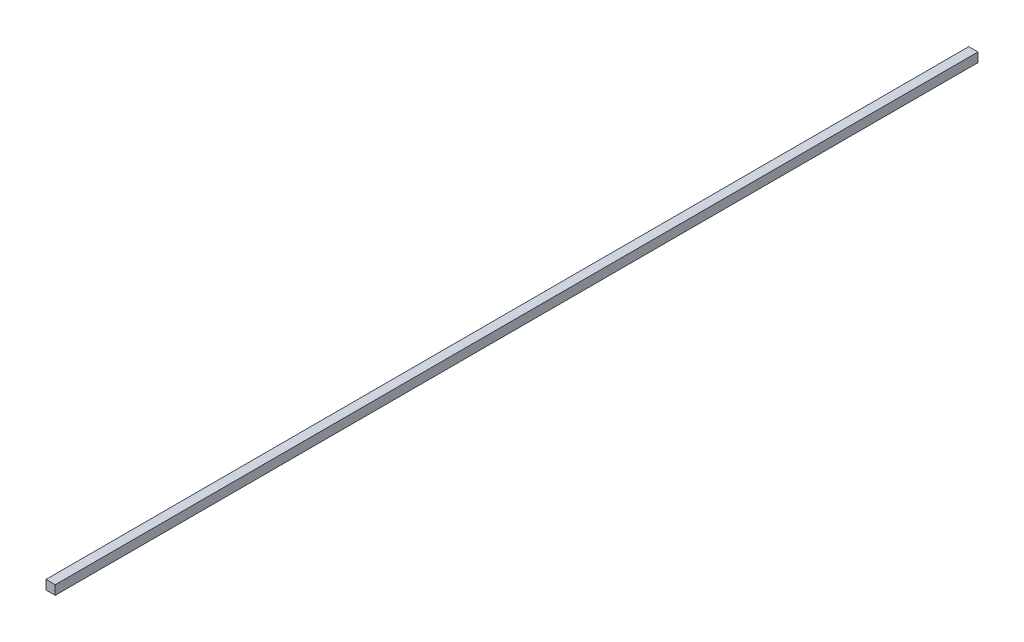
ISO-10303-21;
HEADER;
FILE_DESCRIPTION(('STEP AP214'),'2;1');
FILE_NAME('part.step','',(''),(''),'','','');
FILE_SCHEMA(('AUTOMOTIVE_DESIGN { 1 0 10303 214 1 1 1 1 }'));
ENDSEC;
DATA;
#1=APPLICATION_CONTEXT('core data for automotive mechanical design processes');
#2=APPLICATION_PROTOCOL_DEFINITION('international standard','automotive_design',2000,#1);
#3=PRODUCT_CONTEXT('',#1,'mechanical');
#4=PRODUCT('Part','Part','',(#3));
#5=PRODUCT_RELATED_PRODUCT_CATEGORY('part','',(#4));
#6=PRODUCT_DEFINITION_FORMATION('','',#4);
#7=PRODUCT_DEFINITION_CONTEXT('part definition',#1,'design');
#8=PRODUCT_DEFINITION('design','',#6,#7);
#9=PRODUCT_DEFINITION_SHAPE('','',#8);
#10=(LENGTH_UNIT() NAMED_UNIT(*) SI_UNIT(.MILLI.,.METRE.));
#11=(NAMED_UNIT(*) PLANE_ANGLE_UNIT() SI_UNIT($,.RADIAN.));
#12=(NAMED_UNIT(*) SI_UNIT($,.STERADIAN.) SOLID_ANGLE_UNIT());
#13=UNCERTAINTY_MEASURE_WITH_UNIT(LENGTH_MEASURE(1.E-05),#10,'distance_accuracy_value','');
#14=(GEOMETRIC_REPRESENTATION_CONTEXT(3) GLOBAL_UNCERTAINTY_ASSIGNED_CONTEXT((#13)) GLOBAL_UNIT_ASSIGNED_CONTEXT((#10,
#11,#12)) REPRESENTATION_CONTEXT('',''));
#15=CARTESIAN_POINT('',(0.,0.,0.));
#16=DIRECTION('',(0.,0.,1.));
#17=DIRECTION('',(1.,0.,0.));
#18=AXIS2_PLACEMENT_3D('',#15,#16,#17);
#19=CARTESIAN_POINT('',(10.,-10.,2000.));
#20=DIRECTION('',(-1.,0.,0.));
#21=DIRECTION('',(0.,0.,1.));
#22=AXIS2_PLACEMENT_3D('',#19,#20,#21);
#23=PLANE('',#22);
#24=DIRECTION('',(0.,1.,0.));
#25=VECTOR('',#24,1.);
#26=CARTESIAN_POINT('',(10.,-10.,0.));
#27=LINE('',#26,#25);
#28=CARTESIAN_POINT('',(10.,-10.,0.));
#29=VERTEX_POINT('',#28);
#30=CARTESIAN_POINT('',(10.,10.,0.));
#31=VERTEX_POINT('',#30);
#32=EDGE_CURVE('E102',#29,#31,#27,.T.);
#33=ORIENTED_EDGE('',*,*,#32,.T.);
#34=DIRECTION('',(0.,0.,-1.));
#35=VECTOR('',#34,1.);
#36=CARTESIAN_POINT('',(10.,10.,2000.));
#37=LINE('',#36,#35);
#38=CARTESIAN_POINT('',(10.,10.,2000.));
#39=VERTEX_POINT('',#38);
#40=EDGE_CURVE('E11',#39,#31,#37,.T.);
#41=ORIENTED_EDGE('',*,*,#40,.F.);
#42=DIRECTION('',(0.,1.,0.));
#43=VECTOR('',#42,1.);
#44=CARTESIAN_POINT('',(10.,-10.,2000.));
#45=LINE('',#44,#43);
#46=CARTESIAN_POINT('',(10.,-10.,2000.));
#47=VERTEX_POINT('',#46);
#48=EDGE_CURVE('E90',#47,#39,#45,.T.);
#49=ORIENTED_EDGE('',*,*,#48,.F.);
#50=DIRECTION('',(0.,0.,-1.));
#51=VECTOR('',#50,1.);
#52=CARTESIAN_POINT('',(10.,-10.,2000.));
#53=LINE('',#52,#51);
#54=EDGE_CURVE('E98',#47,#29,#53,.T.);
#55=ORIENTED_EDGE('',*,*,#54,.T.);
#56=EDGE_LOOP('',(#33,#41,#49,#55));
#57=FACE_BOUND('',#56,.T.);
#58=ADVANCED_FACE('F39',(#57),#23,.F.);
#59=CARTESIAN_POINT('',(-10.,10.,2000.));
#60=DIRECTION('',(0.,-1.,0.));
#61=DIRECTION('',(0.,0.,-1.));
#62=AXIS2_PLACEMENT_3D('',#59,#60,#61);
#63=PLANE('',#62);
#64=DIRECTION('',(-1.,0.,0.));
#65=VECTOR('',#64,1.);
#66=CARTESIAN_POINT('',(-10.,10.,0.));
#67=LINE('',#66,#65);
#68=CARTESIAN_POINT('',(-10.,10.,0.));
#69=VERTEX_POINT('',#68);
#70=EDGE_CURVE('E94',#31,#69,#67,.T.);
#71=ORIENTED_EDGE('',*,*,#70,.T.);
#72=DIRECTION('',(0.,0.,-1.));
#73=VECTOR('',#72,1.);
#74=CARTESIAN_POINT('',(-10.,10.,2000.));
#75=LINE('',#74,#73);
#76=CARTESIAN_POINT('',(-10.,10.,2000.));
#77=VERTEX_POINT('',#76);
#78=EDGE_CURVE('E47',#77,#69,#75,.T.);
#79=ORIENTED_EDGE('',*,*,#78,.F.);
#80=DIRECTION('',(-1.,0.,0.));
#81=VECTOR('',#80,1.);
#82=CARTESIAN_POINT('',(-10.,10.,2000.));
#83=LINE('',#82,#81);
#84=EDGE_CURVE('E85',#39,#77,#83,.T.);
#85=ORIENTED_EDGE('',*,*,#84,.F.);
#86=ORIENTED_EDGE('',*,*,#40,.T.);
#87=EDGE_LOOP('',(#71,#79,#85,#86));
#88=FACE_BOUND('',#87,.T.);
#89=ADVANCED_FACE('F93',(#88),#63,.F.);
#90=CARTESIAN_POINT('',(-10.,-10.,2000.));
#91=DIRECTION('',(1.,0.,0.));
#92=DIRECTION('',(0.,0.,-1.));
#93=AXIS2_PLACEMENT_3D('',#90,#91,#92);
#94=PLANE('',#93);
#95=DIRECTION('',(0.,-1.,0.));
#96=VECTOR('',#95,1.);
#97=CARTESIAN_POINT('',(-10.,-10.,0.));
#98=LINE('',#97,#96);
#99=CARTESIAN_POINT('',(-10.,-10.,0.));
#100=VERTEX_POINT('',#99);
#101=EDGE_CURVE('E72',#69,#100,#98,.T.);
#102=ORIENTED_EDGE('',*,*,#101,.T.);
#103=DIRECTION('',(0.,0.,-1.));
#104=VECTOR('',#103,1.);
#105=CARTESIAN_POINT('',(-10.,-10.,2000.));
#106=LINE('',#105,#104);
#107=CARTESIAN_POINT('',(-10.,-10.,2000.));
#108=VERTEX_POINT('',#107);
#109=EDGE_CURVE('E95',#108,#100,#106,.T.);
#110=ORIENTED_EDGE('',*,*,#109,.F.);
#111=DIRECTION('',(0.,-1.,0.));
#112=VECTOR('',#111,1.);
#113=CARTESIAN_POINT('',(-10.,-10.,2000.));
#114=LINE('',#113,#112);
#115=EDGE_CURVE('E88',#77,#108,#114,.T.);
#116=ORIENTED_EDGE('',*,*,#115,.F.);
#117=ORIENTED_EDGE('',*,*,#78,.T.);
#118=EDGE_LOOP('',(#102,#110,#116,#117));
#119=FACE_BOUND('',#118,.T.);
#120=ADVANCED_FACE('F96',(#119),#94,.F.);
#121=CARTESIAN_POINT('',(-10.,-10.,2000.));
#122=DIRECTION('',(0.,1.,0.));
#123=DIRECTION('',(0.,0.,1.));
#124=AXIS2_PLACEMENT_3D('',#121,#122,#123);
#125=PLANE('',#124);
#126=DIRECTION('',(1.,0.,0.));
#127=VECTOR('',#126,1.);
#128=CARTESIAN_POINT('',(-10.,-10.,0.));
#129=LINE('',#128,#127);
#130=EDGE_CURVE('E78',#100,#29,#129,.T.);
#131=ORIENTED_EDGE('',*,*,#130,.T.);
#132=ORIENTED_EDGE('',*,*,#54,.F.);
#133=DIRECTION('',(1.,0.,0.));
#134=VECTOR('',#133,1.);
#135=CARTESIAN_POINT('',(-10.,-10.,2000.));
#136=LINE('',#135,#134);
#137=EDGE_CURVE('E55',#108,#47,#136,.T.);
#138=ORIENTED_EDGE('',*,*,#137,.F.);
#139=ORIENTED_EDGE('',*,*,#109,.T.);
#140=EDGE_LOOP('',(#131,#132,#138,#139));
#141=FACE_BOUND('',#140,.T.);
#142=ADVANCED_FACE('F109',(#141),#125,.F.);
#143=CARTESIAN_POINT('',(0.,0.,2000.));
#144=DIRECTION('',(0.,0.,-1.));
#145=DIRECTION('',(-1.,0.,0.));
#146=AXIS2_PLACEMENT_3D('',#143,#144,#145);
#147=PLANE('',#146);
#148=ORIENTED_EDGE('',*,*,#48,.T.);
#149=ORIENTED_EDGE('',*,*,#84,.T.);
#150=ORIENTED_EDGE('',*,*,#115,.T.);
#151=ORIENTED_EDGE('',*,*,#137,.T.);
#152=EDGE_LOOP('',(#148,#149,#150,#151));
#153=FACE_BOUND('',#152,.T.);
#154=ADVANCED_FACE('F86',(#153),#147,.F.);
#155=CARTESIAN_POINT('',(0.,0.,0.));
#156=DIRECTION('',(0.,0.,-1.));
#157=DIRECTION('',(-1.,0.,0.));
#158=AXIS2_PLACEMENT_3D('',#155,#156,#157);
#159=PLANE('',#158);
#160=ORIENTED_EDGE('',*,*,#32,.F.);
#161=ORIENTED_EDGE('',*,*,#130,.F.);
#162=ORIENTED_EDGE('',*,*,#101,.F.);
#163=ORIENTED_EDGE('',*,*,#70,.F.);
#164=EDGE_LOOP('',(#160,#161,#162,#163));
#165=FACE_BOUND('',#164,.T.);
#166=ADVANCED_FACE('F112',(#165),#159,.T.);
#167=CLOSED_SHELL('',(#58,#89,#120,#142,#154,#166));
#168=MANIFOLD_SOLID_BREP('B2',#167);
#169=ADVANCED_BREP_SHAPE_REPRESENTATION('',(#18,#168),#14);
#170=SHAPE_DEFINITION_REPRESENTATION(#9,#169);
ENDSEC;
END-ISO-10303-21;
